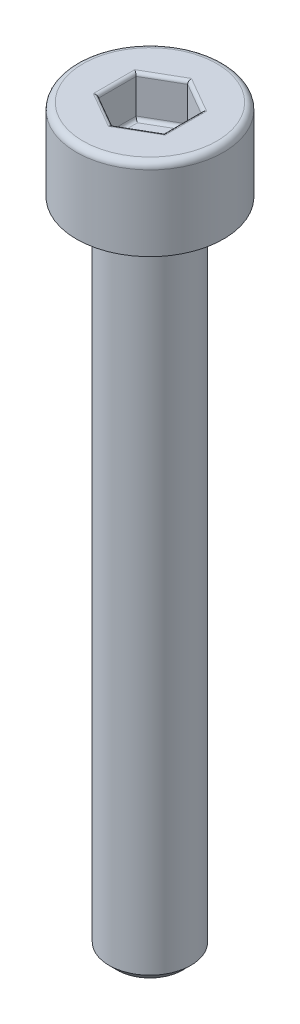
ISO-10303-21;
HEADER;
FILE_DESCRIPTION(('STEP AP214'),'2;1');
FILE_NAME('part.step','',(''),(''),'','','');
FILE_SCHEMA(('AUTOMOTIVE_DESIGN { 1 0 10303 214 1 1 1 1 }'));
ENDSEC;
DATA;
#1=APPLICATION_CONTEXT('core data for automotive mechanical design processes');
#2=APPLICATION_PROTOCOL_DEFINITION('international standard','automotive_design',2000,#1);
#3=PRODUCT_CONTEXT('',#1,'mechanical');
#4=PRODUCT('Part','Part','',(#3));
#5=PRODUCT_RELATED_PRODUCT_CATEGORY('part','',(#4));
#6=PRODUCT_DEFINITION_FORMATION('','',#4);
#7=PRODUCT_DEFINITION_CONTEXT('part definition',#1,'design');
#8=PRODUCT_DEFINITION('design','',#6,#7);
#9=PRODUCT_DEFINITION_SHAPE('','',#8);
#10=(LENGTH_UNIT() NAMED_UNIT(*) SI_UNIT(.MILLI.,.METRE.));
#11=(NAMED_UNIT(*) PLANE_ANGLE_UNIT() SI_UNIT($,.RADIAN.));
#12=(NAMED_UNIT(*) SI_UNIT($,.STERADIAN.) SOLID_ANGLE_UNIT());
#13=UNCERTAINTY_MEASURE_WITH_UNIT(LENGTH_MEASURE(1.E-05),#10,'distance_accuracy_value','');
#14=(GEOMETRIC_REPRESENTATION_CONTEXT(3) GLOBAL_UNCERTAINTY_ASSIGNED_CONTEXT((#13)) GLOBAL_UNIT_ASSIGNED_CONTEXT((#10,
#11,#12)) REPRESENTATION_CONTEXT('',''));
#15=CARTESIAN_POINT('',(0.,0.,0.));
#16=DIRECTION('',(0.,0.,1.));
#17=DIRECTION('',(1.,0.,0.));
#18=AXIS2_PLACEMENT_3D('',#15,#16,#17);
#19=CARTESIAN_POINT('',(0.,-22.5,0.));
#20=DIRECTION('',(0.,-1.,0.));
#21=DIRECTION('',(0.,0.,-1.));
#22=AXIS2_PLACEMENT_3D('',#19,#20,#21);
#23=PLANE('',#22);
#24=CARTESIAN_POINT('',(0.,-22.5,0.));
#25=DIRECTION('',(0.,-1.,0.));
#26=DIRECTION('',(0.,0.,-1.));
#27=AXIS2_PLACEMENT_3D('',#24,#25,#26);
#28=CIRCLE('',#27,0.999999999999994);
#29=CARTESIAN_POINT('',(0.,-22.5,-0.999999999999994));
#30=VERTEX_POINT('',#29);
#31=EDGE_CURVE('E261',#30,#30,#28,.T.);
#32=ORIENTED_EDGE('',*,*,#31,.T.);
#33=EDGE_LOOP('',(#32));
#34=FACE_BOUND('',#33,.T.);
#35=ADVANCED_FACE('F33',(#34),#23,.T.);
#36=CARTESIAN_POINT('',(0.,0.,0.));
#37=DIRECTION('',(0.,1.,0.));
#38=DIRECTION('',(0.,0.,1.));
#39=AXIS2_PLACEMENT_3D('',#36,#37,#38);
#40=CYLINDRICAL_SURFACE('',#39,1.25);
#41=CARTESIAN_POINT('',(0.,-2.75,0.));
#42=DIRECTION('',(0.,-1.,0.));
#43=DIRECTION('',(0.,0.,-1.));
#44=AXIS2_PLACEMENT_3D('',#41,#42,#43);
#45=CIRCLE('',#44,1.25);
#46=CARTESIAN_POINT('',(0.,-2.75,-1.25));
#47=VERTEX_POINT('',#46);
#48=EDGE_CURVE('E258',#47,#47,#45,.T.);
#49=ORIENTED_EDGE('',*,*,#48,.T.);
#50=EDGE_LOOP('',(#49));
#51=FACE_BOUND('',#50,.T.);
#52=CARTESIAN_POINT('',(0.,-22.25,0.));
#53=DIRECTION('',(0.,-1.,0.));
#54=DIRECTION('',(0.,0.,-1.));
#55=AXIS2_PLACEMENT_3D('',#52,#53,#54);
#56=CIRCLE('',#55,1.25);
#57=CARTESIAN_POINT('',(0.,-22.25,-1.25));
#58=VERTEX_POINT('',#57);
#59=EDGE_CURVE('E255',#58,#58,#56,.F.);
#60=ORIENTED_EDGE('',*,*,#59,.T.);
#61=EDGE_LOOP('',(#60));
#62=FACE_BOUND('',#61,.T.);
#63=ADVANCED_FACE('F287',(#51,#62),#40,.T.);
#64=CARTESIAN_POINT('',(-1.25,-2.5,0.));
#65=DIRECTION('',(0.,-1.,0.));
#66=DIRECTION('',(0.,0.,-1.));
#67=AXIS2_PLACEMENT_3D('',#64,#65,#66);
#68=PLANE('',#67);
#69=CARTESIAN_POINT('',(0.,-2.5,0.));
#70=DIRECTION('',(0.,-1.,0.));
#71=DIRECTION('',(0.,0.,-1.));
#72=AXIS2_PLACEMENT_3D('',#69,#70,#71);
#73=CIRCLE('',#72,1.49999999999999);
#74=CARTESIAN_POINT('',(0.,-2.5,-1.49999999999999));
#75=VERTEX_POINT('',#74);
#76=EDGE_CURVE('E252',#75,#75,#73,.F.);
#77=ORIENTED_EDGE('',*,*,#76,.T.);
#78=EDGE_LOOP('',(#77));
#79=FACE_BOUND('',#78,.T.);
#80=CARTESIAN_POINT('',(0.,-2.5,0.));
#81=DIRECTION('',(0.,1.,0.));
#82=DIRECTION('',(0.,0.,1.));
#83=AXIS2_PLACEMENT_3D('',#80,#81,#82);
#84=CIRCLE('',#83,2.25);
#85=CARTESIAN_POINT('',(0.,-2.5,2.25));
#86=VERTEX_POINT('',#85);
#87=EDGE_CURVE('E249',#86,#86,#84,.T.);
#88=ORIENTED_EDGE('',*,*,#87,.F.);
#89=EDGE_LOOP('',(#88));
#90=FACE_BOUND('',#89,.T.);
#91=ADVANCED_FACE('F293',(#79,#90),#68,.T.);
#92=CARTESIAN_POINT('',(0.,0.,0.));
#93=DIRECTION('',(0.,1.,0.));
#94=DIRECTION('',(0.,0.,1.));
#95=AXIS2_PLACEMENT_3D('',#92,#93,#94);
#96=CYLINDRICAL_SURFACE('',#95,2.25);
#97=CARTESIAN_POINT('',(0.,-0.2,0.));
#98=DIRECTION('',(0.,1.,0.));
#99=DIRECTION('',(0.,0.,1.));
#100=AXIS2_PLACEMENT_3D('',#97,#98,#99);
#101=CIRCLE('',#100,2.25);
#102=CARTESIAN_POINT('',(0.,-0.2,2.25));
#103=VERTEX_POINT('',#102);
#104=EDGE_CURVE('E159',#103,#103,#101,.F.);
#105=ORIENTED_EDGE('',*,*,#104,.T.);
#106=EDGE_LOOP('',(#105));
#107=FACE_BOUND('',#106,.T.);
#108=ORIENTED_EDGE('',*,*,#87,.T.);
#109=EDGE_LOOP('',(#108));
#110=FACE_BOUND('',#109,.T.);
#111=ADVANCED_FACE('F303',(#107,#110),#96,.T.);
#112=CARTESIAN_POINT('',(-2.25,0.,0.));
#113=DIRECTION('',(0.,1.,0.));
#114=DIRECTION('',(0.,0.,1.));
#115=AXIS2_PLACEMENT_3D('',#112,#113,#114);
#116=PLANE('',#115);
#117=DIRECTION('',(0.,0.,1.));
#118=VECTOR('',#117,1.);
#119=CARTESIAN_POINT('',(-1.1,0.,-0.577350269189627));
#120=LINE('',#119,#118);
#121=CARTESIAN_POINT('',(-1.1,0.,0.635085296108588));
#122=VERTEX_POINT('',#121);
#123=CARTESIAN_POINT('',(-1.1,0.,-0.635085296108589));
#124=VERTEX_POINT('',#123);
#125=EDGE_CURVE('E175',#122,#124,#120,.F.);
#126=ORIENTED_EDGE('',*,*,#125,.T.);
#127=DIRECTION('',(-0.866025403784439,0.,0.5));
#128=VECTOR('',#127,1.);
#129=CARTESIAN_POINT('',(-0.0500000000000009,0.,-1.2413030787577));
#130=LINE('',#129,#128);
#131=CARTESIAN_POINT('',(0.,0.,-1.27017059221718));
#132=VERTEX_POINT('',#131);
#133=EDGE_CURVE('E134',#124,#132,#130,.F.);
#134=ORIENTED_EDGE('',*,*,#133,.T.);
#135=DIRECTION('',(-0.866025403784439,0.,-0.5));
#136=VECTOR('',#135,1.);
#137=CARTESIAN_POINT('',(1.05,0.,-0.663952809568071));
#138=LINE('',#137,#136);
#139=CARTESIAN_POINT('',(1.1,0.,-0.63508529610859));
#140=VERTEX_POINT('',#139);
#141=EDGE_CURVE('E161',#132,#140,#138,.F.);
#142=ORIENTED_EDGE('',*,*,#141,.T.);
#143=DIRECTION('',(0.,0.,-1.));
#144=VECTOR('',#143,1.);
#145=CARTESIAN_POINT('',(1.1,0.,0.577350269189625));
#146=LINE('',#145,#144);
#147=CARTESIAN_POINT('',(1.1,0.,0.635085296108588));
#148=VERTEX_POINT('',#147);
#149=EDGE_CURVE('E169',#140,#148,#146,.F.);
#150=ORIENTED_EDGE('',*,*,#149,.T.);
#151=DIRECTION('',(0.866025403784439,0.,-0.5));
#152=VECTOR('',#151,1.);
#153=CARTESIAN_POINT('',(0.0499999999999991,0.,1.24130307875769));
#154=LINE('',#153,#152);
#155=CARTESIAN_POINT('',(0.,0.,1.27017059221718));
#156=VERTEX_POINT('',#155);
#157=EDGE_CURVE('E171',#148,#156,#154,.F.);
#158=ORIENTED_EDGE('',*,*,#157,.T.);
#159=DIRECTION('',(0.866025403784439,0.,0.5));
#160=VECTOR('',#159,1.);
#161=CARTESIAN_POINT('',(-1.05,0.,0.663952809568069));
#162=LINE('',#161,#160);
#163=EDGE_CURVE('E173',#156,#122,#162,.F.);
#164=ORIENTED_EDGE('',*,*,#163,.T.);
#165=EDGE_LOOP('',(#126,#134,#142,#150,#158,#164));
#166=FACE_BOUND('',#165,.T.);
#167=CARTESIAN_POINT('',(0.,0.,0.));
#168=DIRECTION('',(0.,1.,0.));
#169=DIRECTION('',(0.,0.,1.));
#170=AXIS2_PLACEMENT_3D('',#167,#168,#169);
#171=CIRCLE('',#170,2.05);
#172=CARTESIAN_POINT('',(0.,0.,2.05));
#173=VERTEX_POINT('',#172);
#174=EDGE_CURVE('E164',#173,#173,#171,.T.);
#175=ORIENTED_EDGE('',*,*,#174,.T.);
#176=EDGE_LOOP('',(#175));
#177=FACE_BOUND('',#176,.T.);
#178=ADVANCED_FACE('F266',(#166,#177),#116,.T.);
#179=CARTESIAN_POINT('',(0.,-2.5,0.));
#180=DIRECTION('',(0.,1.,0.));
#181=DIRECTION('',(0.,0.,1.));
#182=AXIS2_PLACEMENT_3D('',#179,#180,#181);
#183=CONICAL_SURFACE('',#182,1.49999999999999,0.78539816339745);
#184=ORIENTED_EDGE('',*,*,#48,.F.);
#185=EDGE_LOOP('',(#184));
#186=FACE_BOUND('',#185,.T.);
#187=ORIENTED_EDGE('',*,*,#76,.F.);
#188=EDGE_LOOP('',(#187));
#189=FACE_BOUND('',#188,.T.);
#190=ADVANCED_FACE('F281',(#186,#189),#183,.T.);
#191=CARTESIAN_POINT('',(0.,-22.25,0.));
#192=DIRECTION('',(0.,1.,0.));
#193=DIRECTION('',(0.,0.,1.));
#194=AXIS2_PLACEMENT_3D('',#191,#192,#193);
#195=CONICAL_SURFACE('',#194,1.25,0.78539816339744);
#196=ORIENTED_EDGE('',*,*,#31,.F.);
#197=EDGE_LOOP('',(#196));
#198=FACE_BOUND('',#197,.T.);
#199=ORIENTED_EDGE('',*,*,#59,.F.);
#200=EDGE_LOOP('',(#199));
#201=FACE_BOUND('',#200,.T.);
#202=ADVANCED_FACE('F271',(#198,#201),#195,.T.);
#203=CARTESIAN_POINT('',(0.,-0.2,0.));
#204=DIRECTION('',(0.,1.,0.));
#205=DIRECTION('',(0.,0.,1.));
#206=AXIS2_PLACEMENT_3D('',#203,#204,#205);
#207=TOROIDAL_SURFACE('',#206,2.05,0.2);
#208=ORIENTED_EDGE('',*,*,#104,.F.);
#209=EDGE_LOOP('',(#208));
#210=FACE_BOUND('',#209,.T.);
#211=ORIENTED_EDGE('',*,*,#174,.F.);
#212=EDGE_LOOP('',(#211));
#213=FACE_BOUND('',#212,.T.);
#214=ADVANCED_FACE('F268',(#210,#213),#207,.T.);
#215=CARTESIAN_POINT('',(0.999999999999998,-1.25,-0.577350269189627));
#216=DIRECTION('',(0.5,0.,-0.866025403784439));
#217=DIRECTION('',(-0.866025403784439,0.,-0.5));
#218=AXIS2_PLACEMENT_3D('',#215,#216,#217);
#219=PLANE('',#218);
#220=DIRECTION('',(0.,1.,0.));
#221=VECTOR('',#220,1.);
#222=CARTESIAN_POINT('',(0.999999999999998,-1.25,-0.577350269189627));
#223=LINE('',#222,#221);
#224=CARTESIAN_POINT('',(0.999999999999998,-1.15,-0.577350269189627));
#225=VERTEX_POINT('',#224);
#226=CARTESIAN_POINT('',(0.999999999999998,-0.1,-0.577350269189627));
#227=VERTEX_POINT('',#226);
#228=EDGE_CURVE('E243',#225,#227,#223,.T.);
#229=ORIENTED_EDGE('',*,*,#228,.T.);
#230=DIRECTION('',(-0.866025403784439,0.,-0.5));
#231=VECTOR('',#230,1.);
#232=CARTESIAN_POINT('',(0.,-0.1,-1.15470053837925));
#233=LINE('',#232,#231);
#234=CARTESIAN_POINT('',(0.,-0.1,-1.15470053837925));
#235=VERTEX_POINT('',#234);
#236=EDGE_CURVE('E195',#227,#235,#233,.T.);
#237=ORIENTED_EDGE('',*,*,#236,.T.);
#238=DIRECTION('',(0.,1.,0.));
#239=VECTOR('',#238,1.);
#240=CARTESIAN_POINT('',(0.,-1.25,-1.15470053837925));
#241=LINE('',#240,#239);
#242=CARTESIAN_POINT('',(0.,-1.15,-1.15470053837925));
#243=VERTEX_POINT('',#242);
#244=EDGE_CURVE('E145',#243,#235,#241,.T.);
#245=ORIENTED_EDGE('',*,*,#244,.F.);
#246=DIRECTION('',(-0.866025403784439,0.,-0.5));
#247=VECTOR('',#246,1.);
#248=CARTESIAN_POINT('',(0.999999999999998,-1.15,-0.577350269189627));
#249=LINE('',#248,#247);
#250=EDGE_CURVE('E193',#243,#225,#249,.F.);
#251=ORIENTED_EDGE('',*,*,#250,.T.);
#252=EDGE_LOOP('',(#229,#237,#245,#251));
#253=FACE_BOUND('',#252,.T.);
#254=ADVANCED_FACE('F270',(#253),#219,.F.);
#255=CARTESIAN_POINT('',(0.999999999999999,-1.25,0.577350269189625));
#256=DIRECTION('',(1.,0.,0.));
#257=DIRECTION('',(0.,0.,-1.));
#258=AXIS2_PLACEMENT_3D('',#255,#256,#257);
#259=PLANE('',#258);
#260=DIRECTION('',(0.,1.,0.));
#261=VECTOR('',#260,1.);
#262=CARTESIAN_POINT('',(0.999999999999999,-1.25,0.577350269189625));
#263=LINE('',#262,#261);
#264=CARTESIAN_POINT('',(0.999999999999999,-1.15,0.577350269189625));
#265=VERTEX_POINT('',#264);
#266=CARTESIAN_POINT('',(0.999999999999999,-0.1,0.577350269189625));
#267=VERTEX_POINT('',#266);
#268=EDGE_CURVE('E240',#265,#267,#263,.T.);
#269=ORIENTED_EDGE('',*,*,#268,.T.);
#270=DIRECTION('',(0.,0.,-1.));
#271=VECTOR('',#270,1.);
#272=CARTESIAN_POINT('',(0.999999999999998,-0.1,-0.577350269189627));
#273=LINE('',#272,#271);
#274=EDGE_CURVE('E191',#267,#227,#273,.T.);
#275=ORIENTED_EDGE('',*,*,#274,.T.);
#276=ORIENTED_EDGE('',*,*,#228,.F.);
#277=DIRECTION('',(0.,0.,-1.));
#278=VECTOR('',#277,1.);
#279=CARTESIAN_POINT('',(0.999999999999999,-1.15,0.577350269189625));
#280=LINE('',#279,#278);
#281=EDGE_CURVE('E188',#225,#265,#280,.F.);
#282=ORIENTED_EDGE('',*,*,#281,.T.);
#283=EDGE_LOOP('',(#269,#275,#276,#282));
#284=FACE_BOUND('',#283,.T.);
#285=ADVANCED_FACE('F278',(#284),#259,.F.);
#286=CARTESIAN_POINT('',(0.,-1.25,1.15470053837925));
#287=DIRECTION('',(0.5,0.,0.866025403784439));
#288=DIRECTION('',(0.866025403784439,0.,-0.5));
#289=AXIS2_PLACEMENT_3D('',#286,#287,#288);
#290=PLANE('',#289);
#291=DIRECTION('',(0.,1.,0.));
#292=VECTOR('',#291,1.);
#293=CARTESIAN_POINT('',(0.,-1.25,1.15470053837925));
#294=LINE('',#293,#292);
#295=CARTESIAN_POINT('',(0.,-1.15,1.15470053837925));
#296=VERTEX_POINT('',#295);
#297=CARTESIAN_POINT('',(0.,-0.1,1.15470053837925));
#298=VERTEX_POINT('',#297);
#299=EDGE_CURVE('E237',#296,#298,#294,.T.);
#300=ORIENTED_EDGE('',*,*,#299,.T.);
#301=DIRECTION('',(0.866025403784439,0.,-0.5));
#302=VECTOR('',#301,1.);
#303=CARTESIAN_POINT('',(0.999999999999999,-0.1,0.577350269189625));
#304=LINE('',#303,#302);
#305=EDGE_CURVE('E186',#298,#267,#304,.T.);
#306=ORIENTED_EDGE('',*,*,#305,.T.);
#307=ORIENTED_EDGE('',*,*,#268,.F.);
#308=DIRECTION('',(0.866025403784439,0.,-0.5));
#309=VECTOR('',#308,1.);
#310=CARTESIAN_POINT('',(0.,-1.15,1.15470053837925));
#311=LINE('',#310,#309);
#312=EDGE_CURVE('E184',#265,#296,#311,.F.);
#313=ORIENTED_EDGE('',*,*,#312,.T.);
#314=EDGE_LOOP('',(#300,#306,#307,#313));
#315=FACE_BOUND('',#314,.T.);
#316=ADVANCED_FACE('F327',(#315),#290,.F.);
#317=CARTESIAN_POINT('',(-1.,-1.25,0.577350269189625));
#318=DIRECTION('',(-0.5,0.,0.866025403784438));
#319=DIRECTION('',(0.866025403784439,0.,0.5));
#320=AXIS2_PLACEMENT_3D('',#317,#318,#319);
#321=PLANE('',#320);
#322=DIRECTION('',(0.,1.,0.));
#323=VECTOR('',#322,1.);
#324=CARTESIAN_POINT('',(-1.,-1.25,0.577350269189625));
#325=LINE('',#324,#323);
#326=CARTESIAN_POINT('',(-1.,-1.15,0.577350269189625));
#327=VERTEX_POINT('',#326);
#328=CARTESIAN_POINT('',(-1.,-0.1,0.577350269189625));
#329=VERTEX_POINT('',#328);
#330=EDGE_CURVE('E128',#327,#329,#325,.T.);
#331=ORIENTED_EDGE('',*,*,#330,.T.);
#332=DIRECTION('',(0.866025403784439,0.,0.5));
#333=VECTOR('',#332,1.);
#334=CARTESIAN_POINT('',(0.,-0.1,1.15470053837925));
#335=LINE('',#334,#333);
#336=EDGE_CURVE('E182',#329,#298,#335,.T.);
#337=ORIENTED_EDGE('',*,*,#336,.T.);
#338=ORIENTED_EDGE('',*,*,#299,.F.);
#339=DIRECTION('',(0.866025403784439,0.,0.5));
#340=VECTOR('',#339,1.);
#341=CARTESIAN_POINT('',(-1.,-1.15,0.577350269189625));
#342=LINE('',#341,#340);
#343=EDGE_CURVE('E180',#296,#327,#342,.F.);
#344=ORIENTED_EDGE('',*,*,#343,.T.);
#345=EDGE_LOOP('',(#331,#337,#338,#344));
#346=FACE_BOUND('',#345,.T.);
#347=ADVANCED_FACE('F234',(#346),#321,.F.);
#348=CARTESIAN_POINT('',(-1.,-1.25,-0.577350269189627));
#349=DIRECTION('',(-1.,0.,0.));
#350=DIRECTION('',(0.,0.,1.));
#351=AXIS2_PLACEMENT_3D('',#348,#349,#350);
#352=PLANE('',#351);
#353=DIRECTION('',(0.,1.,0.));
#354=VECTOR('',#353,1.);
#355=CARTESIAN_POINT('',(-1.,-1.25,-0.577350269189627));
#356=LINE('',#355,#354);
#357=CARTESIAN_POINT('',(-1.,-1.15,-0.577350269189627));
#358=VERTEX_POINT('',#357);
#359=CARTESIAN_POINT('',(-1.,-0.1,-0.577350269189627));
#360=VERTEX_POINT('',#359);
#361=EDGE_CURVE('E126',#358,#360,#356,.T.);
#362=ORIENTED_EDGE('',*,*,#361,.T.);
#363=DIRECTION('',(0.,0.,1.));
#364=VECTOR('',#363,1.);
#365=CARTESIAN_POINT('',(-1.,-0.1,0.577350269189625));
#366=LINE('',#365,#364);
#367=EDGE_CURVE('E133',#360,#329,#366,.T.);
#368=ORIENTED_EDGE('',*,*,#367,.T.);
#369=ORIENTED_EDGE('',*,*,#330,.F.);
#370=DIRECTION('',(0.,0.,1.));
#371=VECTOR('',#370,1.);
#372=CARTESIAN_POINT('',(-1.,-1.15,-0.577350269189627));
#373=LINE('',#372,#371);
#374=EDGE_CURVE('E123',#327,#358,#373,.F.);
#375=ORIENTED_EDGE('',*,*,#374,.T.);
#376=EDGE_LOOP('',(#362,#368,#369,#375));
#377=FACE_BOUND('',#376,.T.);
#378=ADVANCED_FACE('F125',(#377),#352,.F.);
#379=CARTESIAN_POINT('',(0.,-1.25,-1.15470053837925));
#380=DIRECTION('',(-0.5,0.,-0.866025403784438));
#381=DIRECTION('',(-0.866025403784439,0.,0.5));
#382=AXIS2_PLACEMENT_3D('',#379,#380,#381);
#383=PLANE('',#382);
#384=ORIENTED_EDGE('',*,*,#244,.T.);
#385=DIRECTION('',(-0.866025403784439,0.,0.5));
#386=VECTOR('',#385,1.);
#387=CARTESIAN_POINT('',(-1.,-0.1,-0.577350269189626));
#388=LINE('',#387,#386);
#389=EDGE_CURVE('E144',#235,#360,#388,.T.);
#390=ORIENTED_EDGE('',*,*,#389,.T.);
#391=ORIENTED_EDGE('',*,*,#361,.F.);
#392=DIRECTION('',(-0.866025403784439,0.,0.5));
#393=VECTOR('',#392,1.);
#394=CARTESIAN_POINT('',(0.,-1.15,-1.15470053837925));
#395=LINE('',#394,#393);
#396=EDGE_CURVE('E141',#358,#243,#395,.F.);
#397=ORIENTED_EDGE('',*,*,#396,.T.);
#398=EDGE_LOOP('',(#384,#390,#391,#397));
#399=FACE_BOUND('',#398,.T.);
#400=ADVANCED_FACE('F139',(#399),#383,.F.);
#401=CARTESIAN_POINT('',(0.,-1.25,-1.15470053837925));
#402=DIRECTION('',(0.,1.,0.));
#403=DIRECTION('',(0.,0.,1.));
#404=AXIS2_PLACEMENT_3D('',#401,#402,#403);
#405=PLANE('',#404);
#406=DIRECTION('',(0.866025403784439,0.,-0.5));
#407=VECTOR('',#406,1.);
#408=CARTESIAN_POINT('',(0.949999999999999,-1.25,0.490747728811181));
#409=LINE('',#408,#407);
#410=CARTESIAN_POINT('',(0.,-1.25,1.03923048454133));
#411=VERTEX_POINT('',#410);
#412=CARTESIAN_POINT('',(0.899999999999999,-1.25,0.519615242270663));
#413=VERTEX_POINT('',#412);
#414=EDGE_CURVE('E42',#411,#413,#409,.T.);
#415=ORIENTED_EDGE('',*,*,#414,.T.);
#416=DIRECTION('',(0.,0.,-1.));
#417=VECTOR('',#416,1.);
#418=CARTESIAN_POINT('',(0.899999999999998,-1.25,-1.15470053837925));
#419=LINE('',#418,#417);
#420=CARTESIAN_POINT('',(0.899999999999998,-1.25,-0.519615242270664));
#421=VERTEX_POINT('',#420);
#422=EDGE_CURVE('E11',#413,#421,#419,.T.);
#423=ORIENTED_EDGE('',*,*,#422,.T.);
#424=DIRECTION('',(-0.866025403784439,0.,-0.5));
#425=VECTOR('',#424,1.);
#426=CARTESIAN_POINT('',(-0.0500000000000008,-1.25,-1.06809799800081));
#427=LINE('',#426,#425);
#428=CARTESIAN_POINT('',(0.,-1.25,-1.03923048454133));
#429=VERTEX_POINT('',#428);
#430=EDGE_CURVE('E197',#421,#429,#427,.T.);
#431=ORIENTED_EDGE('',*,*,#430,.T.);
#432=DIRECTION('',(-0.866025403784439,0.,0.5));
#433=VECTOR('',#432,1.);
#434=CARTESIAN_POINT('',(0.0499999999999993,-1.25,-1.06809799800081));
#435=LINE('',#434,#433);
#436=CARTESIAN_POINT('',(-0.9,-1.25,-0.519615242270664));
#437=VERTEX_POINT('',#436);
#438=EDGE_CURVE('E199',#429,#437,#435,.T.);
#439=ORIENTED_EDGE('',*,*,#438,.T.);
#440=DIRECTION('',(0.,0.,1.));
#441=VECTOR('',#440,1.);
#442=CARTESIAN_POINT('',(-0.9,-1.25,-1.15470053837925));
#443=LINE('',#442,#441);
#444=CARTESIAN_POINT('',(-0.9,-1.25,0.519615242270662));
#445=VERTEX_POINT('',#444);
#446=EDGE_CURVE('E150',#437,#445,#443,.T.);
#447=ORIENTED_EDGE('',*,*,#446,.T.);
#448=DIRECTION('',(0.866025403784439,0.,0.5));
#449=VECTOR('',#448,1.);
#450=CARTESIAN_POINT('',(-0.950000000000001,-1.25,0.490747728811181));
#451=LINE('',#450,#449);
#452=EDGE_CURVE('E53',#445,#411,#451,.T.);
#453=ORIENTED_EDGE('',*,*,#452,.T.);
#454=EDGE_LOOP('',(#415,#423,#431,#439,#447,#453));
#455=FACE_BOUND('',#454,.T.);
#456=ADVANCED_FACE('F322',(#455),#405,.T.);
#457=CARTESIAN_POINT('',(0.0499999999999991,-0.1,1.24130307875769));
#458=DIRECTION('',(-0.866025403784439,0.,0.5));
#459=DIRECTION('',(0.5,0.,0.866025403784439));
#460=AXIS2_PLACEMENT_3D('',#457,#458,#459);
#461=CYLINDRICAL_SURFACE('',#460,0.1);
#462=CARTESIAN_POINT('',(0.,-0.1,1.27017059221718));
#463=DIRECTION('',(-1.,0.,0.));
#464=DIRECTION('',(0.,0.,-1.));
#465=AXIS2_PLACEMENT_3D('',#462,#463,#464);
#466=ELLIPSE('',#465,0.115470053837925,0.1);
#467=EDGE_CURVE('E214',#156,#298,#466,.T.);
#468=ORIENTED_EDGE('',*,*,#467,.F.);
#469=ORIENTED_EDGE('',*,*,#157,.F.);
#470=CARTESIAN_POINT('',(1.1,-0.1,0.635085296108588));
#471=DIRECTION('',(-0.5,0.,0.866025403784439));
#472=DIRECTION('',(-0.866025403784439,0.,-0.5));
#473=AXIS2_PLACEMENT_3D('',#470,#471,#472);
#474=ELLIPSE('',#473,0.115470053837925,0.1);
#475=EDGE_CURVE('E217',#267,#148,#474,.F.);
#476=ORIENTED_EDGE('',*,*,#475,.F.);
#477=ORIENTED_EDGE('',*,*,#305,.F.);
#478=EDGE_LOOP('',(#468,#469,#476,#477));
#479=FACE_BOUND('',#478,.T.);
#480=ADVANCED_FACE('F334',(#479),#461,.T.);
#481=CARTESIAN_POINT('',(1.1,-0.1,0.577350269189625));
#482=DIRECTION('',(0.,0.,1.));
#483=DIRECTION('',(1.,0.,0.));
#484=AXIS2_PLACEMENT_3D('',#481,#482,#483);
#485=CYLINDRICAL_SURFACE('',#484,0.1);
#486=ORIENTED_EDGE('',*,*,#475,.T.);
#487=ORIENTED_EDGE('',*,*,#149,.F.);
#488=CARTESIAN_POINT('',(1.1,-0.1,-0.63508529610859));
#489=DIRECTION('',(0.5,0.,0.866025403784439));
#490=DIRECTION('',(-0.866025403784439,0.,0.5));
#491=AXIS2_PLACEMENT_3D('',#488,#489,#490);
#492=ELLIPSE('',#491,0.115470053837925,0.1);
#493=EDGE_CURVE('E211',#227,#140,#492,.F.);
#494=ORIENTED_EDGE('',*,*,#493,.F.);
#495=ORIENTED_EDGE('',*,*,#274,.F.);
#496=EDGE_LOOP('',(#486,#487,#494,#495));
#497=FACE_BOUND('',#496,.T.);
#498=ADVANCED_FACE('F338',(#497),#485,.T.);
#499=CARTESIAN_POINT('',(-1.05,-0.1,0.663952809568069));
#500=DIRECTION('',(-0.866025403784439,0.,-0.5));
#501=DIRECTION('',(-0.5,0.,0.866025403784438));
#502=AXIS2_PLACEMENT_3D('',#499,#500,#501);
#503=CYLINDRICAL_SURFACE('',#502,0.1);
#504=ORIENTED_EDGE('',*,*,#467,.T.);
#505=ORIENTED_EDGE('',*,*,#336,.F.);
#506=CARTESIAN_POINT('',(-1.1,-0.1,0.635085296108587));
#507=DIRECTION('',(-0.5,0.,-0.866025403784439));
#508=DIRECTION('',(0.866025403784439,0.,-0.5));
#509=AXIS2_PLACEMENT_3D('',#506,#507,#508);
#510=ELLIPSE('',#509,0.115470053837925,0.1);
#511=EDGE_CURVE('E208',#122,#329,#510,.T.);
#512=ORIENTED_EDGE('',*,*,#511,.F.);
#513=ORIENTED_EDGE('',*,*,#163,.F.);
#514=EDGE_LOOP('',(#504,#505,#512,#513));
#515=FACE_BOUND('',#514,.T.);
#516=ADVANCED_FACE('F344',(#515),#503,.T.);
#517=CARTESIAN_POINT('',(1.05,-0.1,-0.663952809568071));
#518=DIRECTION('',(0.866025403784439,0.,0.5));
#519=DIRECTION('',(0.5,0.,-0.866025403784439));
#520=AXIS2_PLACEMENT_3D('',#517,#518,#519);
#521=CYLINDRICAL_SURFACE('',#520,0.1);
#522=ORIENTED_EDGE('',*,*,#493,.T.);
#523=ORIENTED_EDGE('',*,*,#141,.F.);
#524=CARTESIAN_POINT('',(0.,-0.1,-1.27017059221718));
#525=DIRECTION('',(1.,0.,0.));
#526=DIRECTION('',(0.,0.,-1.));
#527=AXIS2_PLACEMENT_3D('',#524,#525,#526);
#528=ELLIPSE('',#527,0.115470053837925,0.1);
#529=EDGE_CURVE('E206',#235,#132,#528,.F.);
#530=ORIENTED_EDGE('',*,*,#529,.F.);
#531=ORIENTED_EDGE('',*,*,#236,.F.);
#532=EDGE_LOOP('',(#522,#523,#530,#531));
#533=FACE_BOUND('',#532,.T.);
#534=ADVANCED_FACE('F374',(#533),#521,.T.);
#535=CARTESIAN_POINT('',(-1.1,-0.1,-0.577350269189627));
#536=DIRECTION('',(0.,0.,-1.));
#537=DIRECTION('',(-1.,0.,0.));
#538=AXIS2_PLACEMENT_3D('',#535,#536,#537);
#539=CYLINDRICAL_SURFACE('',#538,0.1);
#540=ORIENTED_EDGE('',*,*,#511,.T.);
#541=ORIENTED_EDGE('',*,*,#367,.F.);
#542=CARTESIAN_POINT('',(-1.1,-0.1,-0.635085296108589));
#543=DIRECTION('',(0.5,0.,-0.866025403784439));
#544=DIRECTION('',(0.866025403784439,0.,0.5));
#545=AXIS2_PLACEMENT_3D('',#542,#543,#544);
#546=ELLIPSE('',#545,0.115470053837925,0.1);
#547=EDGE_CURVE('E204',#124,#360,#546,.T.);
#548=ORIENTED_EDGE('',*,*,#547,.F.);
#549=ORIENTED_EDGE('',*,*,#125,.F.);
#550=EDGE_LOOP('',(#540,#541,#548,#549));
#551=FACE_BOUND('',#550,.T.);
#552=ADVANCED_FACE('F369',(#551),#539,.T.);
#553=CARTESIAN_POINT('',(-0.0500000000000009,-0.1,-1.2413030787577));
#554=DIRECTION('',(0.866025403784439,0.,-0.5));
#555=DIRECTION('',(-0.5,0.,-0.866025403784438));
#556=AXIS2_PLACEMENT_3D('',#553,#554,#555);
#557=CYLINDRICAL_SURFACE('',#556,0.1);
#558=ORIENTED_EDGE('',*,*,#529,.T.);
#559=ORIENTED_EDGE('',*,*,#133,.F.);
#560=ORIENTED_EDGE('',*,*,#547,.T.);
#561=ORIENTED_EDGE('',*,*,#389,.F.);
#562=EDGE_LOOP('',(#558,#559,#560,#561));
#563=FACE_BOUND('',#562,.T.);
#564=ADVANCED_FACE('F365',(#563),#557,.T.);
#565=CARTESIAN_POINT('',(-0.9,-1.15,-1.15470053837925));
#566=DIRECTION('',(0.,0.,1.));
#567=DIRECTION('',(1.,0.,0.));
#568=AXIS2_PLACEMENT_3D('',#565,#566,#567);
#569=CYLINDRICAL_SURFACE('',#568,0.1);
#570=CARTESIAN_POINT('',(-0.900000000000001,-1.15,-0.519615242270664));
#571=DIRECTION('',(-0.5,0.,0.866025403784439));
#572=DIRECTION('',(0.866025403784439,0.,0.5));
#573=AXIS2_PLACEMENT_3D('',#570,#571,#572);
#574=ELLIPSE('',#573,0.115470053837925,0.1);
#575=EDGE_CURVE('E149',#358,#437,#574,.T.);
#576=ORIENTED_EDGE('',*,*,#575,.F.);
#577=ORIENTED_EDGE('',*,*,#374,.F.);
#578=CARTESIAN_POINT('',(-0.9,-1.15,0.519615242270662));
#579=DIRECTION('',(0.5,0.,0.866025403784439));
#580=DIRECTION('',(0.866025403784439,0.,-0.5));
#581=AXIS2_PLACEMENT_3D('',#578,#579,#580);
#582=ELLIPSE('',#581,0.115470053837925,0.1);
#583=EDGE_CURVE('E37',#445,#327,#582,.F.);
#584=ORIENTED_EDGE('',*,*,#583,.F.);
#585=ORIENTED_EDGE('',*,*,#446,.F.);
#586=EDGE_LOOP('',(#576,#577,#584,#585));
#587=FACE_BOUND('',#586,.T.);
#588=ADVANCED_FACE('F35',(#587),#569,.F.);
#589=CARTESIAN_POINT('',(-0.950000000000001,-1.15,0.490747728811181));
#590=DIRECTION('',(0.866025403784439,0.,0.5));
#591=DIRECTION('',(0.5,0.,-0.866025403784438));
#592=AXIS2_PLACEMENT_3D('',#589,#590,#591);
#593=CYLINDRICAL_SURFACE('',#592,0.1);
#594=ORIENTED_EDGE('',*,*,#583,.T.);
#595=ORIENTED_EDGE('',*,*,#343,.F.);
#596=CARTESIAN_POINT('',(0.,-1.15,1.03923048454133));
#597=DIRECTION('',(1.,0.,0.));
#598=DIRECTION('',(0.,0.,-1.));
#599=AXIS2_PLACEMENT_3D('',#596,#597,#598);
#600=ELLIPSE('',#599,0.115470053837925,0.1);
#601=EDGE_CURVE('E153',#411,#296,#600,.F.);
#602=ORIENTED_EDGE('',*,*,#601,.F.);
#603=ORIENTED_EDGE('',*,*,#452,.F.);
#604=EDGE_LOOP('',(#594,#595,#602,#603));
#605=FACE_BOUND('',#604,.T.);
#606=ADVANCED_FACE('F231',(#605),#593,.F.);
#607=CARTESIAN_POINT('',(0.0499999999999993,-1.15,-1.06809799800081));
#608=DIRECTION('',(-0.866025403784439,0.,0.5));
#609=DIRECTION('',(0.5,0.,0.866025403784438));
#610=AXIS2_PLACEMENT_3D('',#607,#608,#609);
#611=CYLINDRICAL_SURFACE('',#610,0.1);
#612=ORIENTED_EDGE('',*,*,#575,.T.);
#613=ORIENTED_EDGE('',*,*,#438,.F.);
#614=CARTESIAN_POINT('',(0.,-1.15,-1.03923048454133));
#615=DIRECTION('',(-1.,0.,0.));
#616=DIRECTION('',(0.,0.,1.));
#617=AXIS2_PLACEMENT_3D('',#614,#615,#616);
#618=ELLIPSE('',#617,0.115470053837925,0.1);
#619=EDGE_CURVE('E157',#243,#429,#618,.T.);
#620=ORIENTED_EDGE('',*,*,#619,.F.);
#621=ORIENTED_EDGE('',*,*,#396,.F.);
#622=EDGE_LOOP('',(#612,#613,#620,#621));
#623=FACE_BOUND('',#622,.T.);
#624=ADVANCED_FACE('F155',(#623),#611,.F.);
#625=CARTESIAN_POINT('',(0.949999999999999,-1.15,0.490747728811181));
#626=DIRECTION('',(0.866025403784439,0.,-0.5));
#627=DIRECTION('',(-0.5,0.,-0.866025403784439));
#628=AXIS2_PLACEMENT_3D('',#625,#626,#627);
#629=CYLINDRICAL_SURFACE('',#628,0.1);
#630=ORIENTED_EDGE('',*,*,#601,.T.);
#631=ORIENTED_EDGE('',*,*,#312,.F.);
#632=CARTESIAN_POINT('',(0.899999999999999,-1.15,0.519615242270662));
#633=DIRECTION('',(0.5,0.,-0.866025403784439));
#634=DIRECTION('',(-0.866025403784439,0.,-0.5));
#635=AXIS2_PLACEMENT_3D('',#632,#633,#634);
#636=ELLIPSE('',#635,0.115470053837925,0.1);
#637=EDGE_CURVE('E222',#413,#265,#636,.F.);
#638=ORIENTED_EDGE('',*,*,#637,.F.);
#639=ORIENTED_EDGE('',*,*,#414,.F.);
#640=EDGE_LOOP('',(#630,#631,#638,#639));
#641=FACE_BOUND('',#640,.T.);
#642=ADVANCED_FACE('F228',(#641),#629,.F.);
#643=CARTESIAN_POINT('',(-0.0500000000000008,-1.15,-1.06809799800081));
#644=DIRECTION('',(-0.866025403784439,0.,-0.5));
#645=DIRECTION('',(-0.5,0.,0.866025403784439));
#646=AXIS2_PLACEMENT_3D('',#643,#644,#645);
#647=CYLINDRICAL_SURFACE('',#646,0.1);
#648=ORIENTED_EDGE('',*,*,#619,.T.);
#649=ORIENTED_EDGE('',*,*,#430,.F.);
#650=CARTESIAN_POINT('',(0.899999999999998,-1.15,-0.519615242270664));
#651=DIRECTION('',(-0.5,0.,-0.866025403784439));
#652=DIRECTION('',(0.866025403784439,0.,-0.5));
#653=AXIS2_PLACEMENT_3D('',#650,#651,#652);
#654=ELLIPSE('',#653,0.115470053837925,0.1);
#655=EDGE_CURVE('E220',#225,#421,#654,.T.);
#656=ORIENTED_EDGE('',*,*,#655,.F.);
#657=ORIENTED_EDGE('',*,*,#250,.F.);
#658=EDGE_LOOP('',(#648,#649,#656,#657));
#659=FACE_BOUND('',#658,.T.);
#660=ADVANCED_FACE('F353',(#659),#647,.F.);
#661=CARTESIAN_POINT('',(0.899999999999998,-1.15,-1.15470053837925));
#662=DIRECTION('',(0.,0.,-1.));
#663=DIRECTION('',(-1.,0.,0.));
#664=AXIS2_PLACEMENT_3D('',#661,#662,#663);
#665=CYLINDRICAL_SURFACE('',#664,0.1);
#666=ORIENTED_EDGE('',*,*,#637,.T.);
#667=ORIENTED_EDGE('',*,*,#281,.F.);
#668=ORIENTED_EDGE('',*,*,#655,.T.);
#669=ORIENTED_EDGE('',*,*,#422,.F.);
#670=EDGE_LOOP('',(#666,#667,#668,#669));
#671=FACE_BOUND('',#670,.T.);
#672=ADVANCED_FACE('F350',(#671),#665,.F.);
#673=CLOSED_SHELL('',(#35,#63,#91,#111,#178,#190,#202,#214,#254,#285,#316,#347,#378,#400,#456,
#480,#498,#516,#534,#552,#564,#588,#606,#624,#642,#660,#672));
#674=MANIFOLD_SOLID_BREP('B2',#673);
#675=ADVANCED_BREP_SHAPE_REPRESENTATION('',(#18,#674),#14);
#676=SHAPE_DEFINITION_REPRESENTATION(#9,#675);
ENDSEC;
END-ISO-10303-21;
